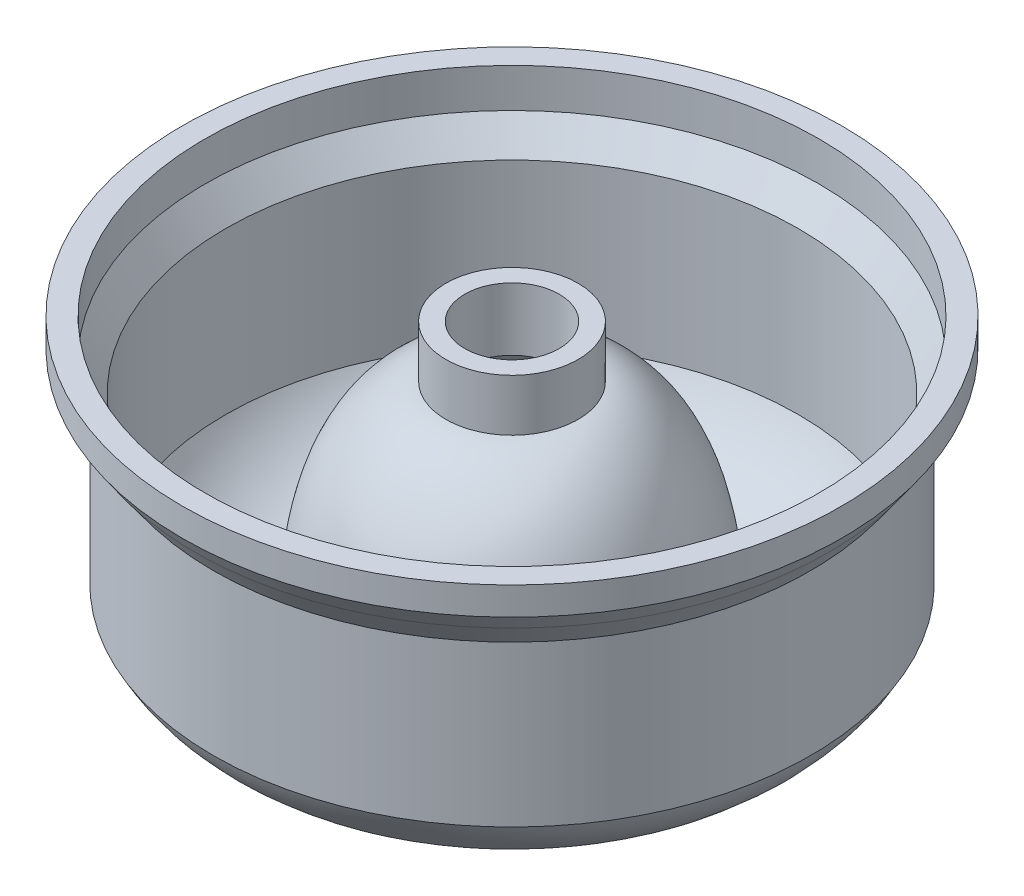
ISO-10303-21;
HEADER;
FILE_DESCRIPTION(('STEP AP214'),'2;1');
FILE_NAME('part.step','',(''),(''),'','','');
FILE_SCHEMA(('AUTOMOTIVE_DESIGN { 1 0 10303 214 1 1 1 1 }'));
ENDSEC;
DATA;
#1=APPLICATION_CONTEXT('core data for automotive mechanical design processes');
#2=APPLICATION_PROTOCOL_DEFINITION('international standard','automotive_design',2000,#1);
#3=PRODUCT_CONTEXT('',#1,'mechanical');
#4=PRODUCT('Part','Part','',(#3));
#5=PRODUCT_RELATED_PRODUCT_CATEGORY('part','',(#4));
#6=PRODUCT_DEFINITION_FORMATION('','',#4);
#7=PRODUCT_DEFINITION_CONTEXT('part definition',#1,'design');
#8=PRODUCT_DEFINITION('design','',#6,#7);
#9=PRODUCT_DEFINITION_SHAPE('','',#8);
#10=(LENGTH_UNIT() NAMED_UNIT(*) SI_UNIT(.MILLI.,.METRE.));
#11=(NAMED_UNIT(*) PLANE_ANGLE_UNIT() SI_UNIT($,.RADIAN.));
#12=(NAMED_UNIT(*) SI_UNIT($,.STERADIAN.) SOLID_ANGLE_UNIT());
#13=UNCERTAINTY_MEASURE_WITH_UNIT(LENGTH_MEASURE(1.E-05),#10,'distance_accuracy_value','');
#14=(GEOMETRIC_REPRESENTATION_CONTEXT(3) GLOBAL_UNCERTAINTY_ASSIGNED_CONTEXT((#13)) GLOBAL_UNIT_ASSIGNED_CONTEXT((#10,
#11,#12)) REPRESENTATION_CONTEXT('',''));
#15=CARTESIAN_POINT('',(0.,0.,0.));
#16=DIRECTION('',(0.,0.,1.));
#17=DIRECTION('',(1.,0.,0.));
#18=AXIS2_PLACEMENT_3D('',#15,#16,#17);
#19=CARTESIAN_POINT('',(-10.5000001564622,30.5810024510066,6.45817993130572E-05));
#20=DIRECTION('',(0.,-1.,0.));
#21=DIRECTION('',(0.,0.,-1.));
#22=AXIS2_PLACEMENT_3D('',#19,#20,#21);
#23=PLANE('',#22);
#24=CARTESIAN_POINT('',(0.,30.5810024510066,6.45817993130572E-05));
#25=DIRECTION('',(0.,-1.,0.));
#26=DIRECTION('',(0.,0.,-1.));
#27=AXIS2_PLACEMENT_3D('',#24,#25,#26);
#28=CIRCLE('',#27,10.5000001564622);
#29=CARTESIAN_POINT('',(0.,30.5810024510066,-10.4999355746629));
#30=VERTEX_POINT('',#29);
#31=EDGE_CURVE('E10',#30,#30,#28,.T.);
#32=ORIENTED_EDGE('',*,*,#31,.F.);
#33=EDGE_LOOP('',(#32));
#34=FACE_BOUND('',#33,.T.);
#35=CARTESIAN_POINT('',(0.,30.5810024510066,6.45817993130572E-05));
#36=DIRECTION('',(0.,-1.,0.));
#37=DIRECTION('',(0.,0.,-1.));
#38=AXIS2_PLACEMENT_3D('',#35,#36,#37);
#39=CIRCLE('',#38,7.50000039115545);
#40=CARTESIAN_POINT('',(0.,30.5810024510066,-7.49993580935613));
#41=VERTEX_POINT('',#40);
#42=EDGE_CURVE('E97',#41,#41,#39,.T.);
#43=ORIENTED_EDGE('',*,*,#42,.T.);
#44=EDGE_LOOP('',(#43));
#45=FACE_BOUND('',#44,.T.);
#46=ADVANCED_FACE('F33',(#34,#45),#23,.F.);
#47=CARTESIAN_POINT('',(0.,-3.16899679462212,6.45817993130572E-05));
#48=DIRECTION('',(0.,-1.,0.));
#49=DIRECTION('',(0.,0.,-1.));
#50=AXIS2_PLACEMENT_3D('',#47,#48,#49);
#51=CYLINDRICAL_SURFACE('',#50,10.5000001564622);
#52=CARTESIAN_POINT('',(0.,22.331003540654,6.45817993130572E-05));
#53=DIRECTION('',(0.,-1.,0.));
#54=DIRECTION('',(0.,0.,-1.));
#55=AXIS2_PLACEMENT_3D('',#52,#53,#54);
#56=CIRCLE('',#55,10.5000001564622);
#57=CARTESIAN_POINT('',(0.,22.331003540654,-10.4999355746629));
#58=VERTEX_POINT('',#57);
#59=EDGE_CURVE('E39',#58,#58,#56,.T.);
#60=ORIENTED_EDGE('',*,*,#59,.F.);
#61=EDGE_LOOP('',(#60));
#62=FACE_BOUND('',#61,.T.);
#63=ORIENTED_EDGE('',*,*,#31,.T.);
#64=EDGE_LOOP('',(#63));
#65=FACE_BOUND('',#64,.T.);
#66=ADVANCED_FACE('F176',(#62,#65),#51,.T.);
#67=CARTESIAN_POINT('',(-10.5000001564622,22.331003540654,6.45817993130572E-05));
#68=CARTESIAN_POINT('',(-12.8042119563069,22.0291969506286,6.45817993130572E-05));
#69=CARTESIAN_POINT('',(-21.4238213403016,16.9942370578348,6.45817993130572E-05));
#70=CARTESIAN_POINT('',(-24.5835315523649,6.47395410737615,6.45817993130572E-05));
#71=CARTESIAN_POINT('',(-25.53859014,-0.47422256425235,6.45817993130572E-05));
#72=B_SPLINE_CURVE_WITH_KNOTS('',3,(#67,#68,#69,#70,#71),.UNSPECIFIED.,.F.,.F.,(4,1,4),(0.,
0.237277576765626,1.),.UNSPECIFIED.);
#73=CARTESIAN_POINT('',(0.,-3.16899679462212,6.45817993130572E-05));
#74=DIRECTION('',(0.,-1.,0.));
#75=AXIS1_PLACEMENT('',#73,#74);
#76=SURFACE_OF_REVOLUTION('',#72,#75);
#77=CARTESIAN_POINT('',(0.,-0.47422256425235,6.45817993130572E-05));
#78=DIRECTION('',(0.,-1.,0.));
#79=DIRECTION('',(0.,0.,-1.));
#80=AXIS2_PLACEMENT_3D('',#77,#78,#79);
#81=CIRCLE('',#80,25.53859014);
#82=CARTESIAN_POINT('',(0.,-0.47422256425235,-25.5385255582007));
#83=VERTEX_POINT('',#82);
#84=EDGE_CURVE('E43',#83,#83,#81,.T.);
#85=ORIENTED_EDGE('',*,*,#84,.F.);
#86=EDGE_LOOP('',(#85));
#87=FACE_BOUND('',#86,.T.);
#88=ORIENTED_EDGE('',*,*,#59,.T.);
#89=EDGE_LOOP('',(#88));
#90=FACE_BOUND('',#89,.T.);
#91=ADVANCED_FACE('F173',(#87,#90),#76,.T.);
#92=CARTESIAN_POINT('',(0.,-3.16899679462212,6.45817993130572E-05));
#93=DIRECTION('',(0.,-1.,0.));
#94=DIRECTION('',(0.,0.,-1.));
#95=AXIS2_PLACEMENT_3D('',#92,#93,#94);
#96=CYLINDRICAL_SURFACE('',#95,25.53859014);
#97=CARTESIAN_POINT('',(0.,-14.5754903953638,6.45817993130572E-05));
#98=DIRECTION('',(0.,-1.,0.));
#99=DIRECTION('',(0.,0.,-1.));
#100=AXIS2_PLACEMENT_3D('',#97,#98,#99);
#101=CIRCLE('',#100,25.53859014);
#102=CARTESIAN_POINT('',(0.,-14.5754903953638,-25.5385255582007));
#103=VERTEX_POINT('',#102);
#104=EDGE_CURVE('E47',#103,#103,#101,.T.);
#105=ORIENTED_EDGE('',*,*,#104,.F.);
#106=EDGE_LOOP('',(#105));
#107=FACE_BOUND('',#106,.T.);
#108=ORIENTED_EDGE('',*,*,#84,.T.);
#109=EDGE_LOOP('',(#108));
#110=FACE_BOUND('',#109,.T.);
#111=ADVANCED_FACE('F169',(#107,#110),#96,.T.);
#112=CARTESIAN_POINT('',(0.,-14.0495839149164,6.45817993130572E-05));
#113=DIRECTION('',(0.,-1.,0.));
#114=DIRECTION('',(0.,0.,-1.));
#115=AXIS2_PLACEMENT_3D('',#112,#113,#114);
#116=TOROIDAL_SURFACE('',#115,26.7235480101972,1.29641921472915);
#117=CARTESIAN_POINT('',(0.,-15.3358713784104,6.45817993130572E-05));
#118=DIRECTION('',(0.,-1.,0.));
#119=DIRECTION('',(0.,0.,-1.));
#120=AXIS2_PLACEMENT_3D('',#117,#118,#119);
#121=CIRCLE('',#120,26.5617847832972);
#122=CARTESIAN_POINT('',(0.,-15.3358713784104,-26.5617202014978));
#123=VERTEX_POINT('',#122);
#124=EDGE_CURVE('E52',#123,#123,#121,.T.);
#125=ORIENTED_EDGE('',*,*,#124,.F.);
#126=EDGE_LOOP('',(#125));
#127=FACE_BOUND('',#126,.T.);
#128=ORIENTED_EDGE('',*,*,#104,.T.);
#129=EDGE_LOOP('',(#128));
#130=FACE_BOUND('',#129,.T.);
#131=ADVANCED_FACE('F165',(#127,#130),#116,.F.);
#132=CARTESIAN_POINT('',(0.,4.38430230998142,6.45817993130572E-05));
#133=DIRECTION('',(0.,-1.,0.));
#134=DIRECTION('',(0.,0.,-1.));
#135=AXIS2_PLACEMENT_3D('',#132,#133,#134);
#136=TOROIDAL_SURFACE('',#135,28.0626253435686,19.777203358607);
#137=CARTESIAN_POINT('',(0.,-4.97394007096082,6.45817993130572E-05));
#138=DIRECTION('',(0.,-1.,0.));
#139=DIRECTION('',(0.,0.,-1.));
#140=AXIS2_PLACEMENT_3D('',#137,#138,#139);
#141=CIRCLE('',#140,45.48562945386);
#142=CARTESIAN_POINT('',(0.,-4.97394007096082,-45.4855648720607));
#143=VERTEX_POINT('',#142);
#144=EDGE_CURVE('E55',#143,#143,#141,.T.);
#145=ORIENTED_EDGE('',*,*,#144,.F.);
#146=EDGE_LOOP('',(#145));
#147=FACE_BOUND('',#146,.T.);
#148=ORIENTED_EDGE('',*,*,#124,.T.);
#149=EDGE_LOOP('',(#148));
#150=FACE_BOUND('',#149,.T.);
#151=ADVANCED_FACE('F161',(#147,#150),#136,.F.);
#152=CARTESIAN_POINT('',(0.,-3.16899679462212,6.45817993130572E-05));
#153=DIRECTION('',(0.,-1.,0.));
#154=DIRECTION('',(0.,0.,-1.));
#155=AXIS2_PLACEMENT_3D('',#152,#153,#154);
#156=CYLINDRICAL_SURFACE('',#155,45.48562945386);
#157=CARTESIAN_POINT('',(0.,20.6186275390306,6.45817993130572E-05));
#158=DIRECTION('',(0.,-1.,0.));
#159=DIRECTION('',(0.,0.,-1.));
#160=AXIS2_PLACEMENT_3D('',#157,#158,#159);
#161=CIRCLE('',#160,45.48562945386);
#162=CARTESIAN_POINT('',(0.,20.6186275390306,-45.4855648720607));
#163=VERTEX_POINT('',#162);
#164=EDGE_CURVE('E58',#163,#163,#161,.T.);
#165=ORIENTED_EDGE('',*,*,#164,.F.);
#166=EDGE_LOOP('',(#165));
#167=FACE_BOUND('',#166,.T.);
#168=ORIENTED_EDGE('',*,*,#144,.T.);
#169=EDGE_LOOP('',(#168));
#170=FACE_BOUND('',#169,.T.);
#171=ADVANCED_FACE('F157',(#167,#170),#156,.F.);
#172=CARTESIAN_POINT('',(0.,20.6186275390306,6.45817993130572E-05));
#173=DIRECTION('',(0.,1.,0.));
#174=DIRECTION('',(0.,0.,1.));
#175=AXIS2_PLACEMENT_3D('',#172,#173,#174);
#176=CONICAL_SURFACE('',#175,45.48562945386,0.628409979727612);
#177=CARTESIAN_POINT('',(0.,25.1223851766911,6.45817993130572E-05));
#178=DIRECTION('',(0.,-1.,0.));
#179=DIRECTION('',(0.,0.,-1.));
#180=AXIS2_PLACEMENT_3D('',#177,#178,#179);
#181=CIRCLE('',#180,48.7584302277292);
#182=CARTESIAN_POINT('',(0.,25.1223851766911,-48.7583656459299));
#183=VERTEX_POINT('',#182);
#184=EDGE_CURVE('E61',#183,#183,#181,.T.);
#185=ORIENTED_EDGE('',*,*,#184,.F.);
#186=EDGE_LOOP('',(#185));
#187=FACE_BOUND('',#186,.T.);
#188=ORIENTED_EDGE('',*,*,#164,.T.);
#189=EDGE_LOOP('',(#188));
#190=FACE_BOUND('',#189,.T.);
#191=ADVANCED_FACE('F153',(#187,#190),#176,.F.);
#192=CARTESIAN_POINT('',(0.,-3.16899679462212,6.45817993130572E-05));
#193=DIRECTION('',(0.,-1.,0.));
#194=DIRECTION('',(0.,0.,-1.));
#195=AXIS2_PLACEMENT_3D('',#192,#193,#194);
#196=CYLINDRICAL_SURFACE('',#195,48.758430227729);
#197=CARTESIAN_POINT('',(0.,31.3310024342427,6.45817993130572E-05));
#198=DIRECTION('',(0.,-1.,0.));
#199=DIRECTION('',(0.,0.,-1.));
#200=AXIS2_PLACEMENT_3D('',#197,#198,#199);
#201=CIRCLE('',#200,48.758430227729);
#202=CARTESIAN_POINT('',(0.,31.3310024342427,-48.7583656459297));
#203=VERTEX_POINT('',#202);
#204=EDGE_CURVE('E64',#203,#203,#201,.T.);
#205=ORIENTED_EDGE('',*,*,#204,.F.);
#206=EDGE_LOOP('',(#205));
#207=FACE_BOUND('',#206,.T.);
#208=ORIENTED_EDGE('',*,*,#184,.T.);
#209=EDGE_LOOP('',(#208));
#210=FACE_BOUND('',#209,.T.);
#211=ADVANCED_FACE('F149',(#207,#210),#196,.F.);
#212=CARTESIAN_POINT('',(-52.358430227729,31.3310024342427,6.45817993130572E-05));
#213=DIRECTION('',(0.,-1.,0.));
#214=DIRECTION('',(0.,0.,-1.));
#215=AXIS2_PLACEMENT_3D('',#212,#213,#214);
#216=PLANE('',#215);
#217=CARTESIAN_POINT('',(0.,31.3310024342427,6.45817993130572E-05));
#218=DIRECTION('',(0.,-1.,0.));
#219=DIRECTION('',(0.,0.,-1.));
#220=AXIS2_PLACEMENT_3D('',#217,#218,#219);
#221=CIRCLE('',#220,52.358430227729);
#222=CARTESIAN_POINT('',(0.,31.3310024342427,-52.3583656459297));
#223=VERTEX_POINT('',#222);
#224=EDGE_CURVE('E67',#223,#223,#221,.T.);
#225=ORIENTED_EDGE('',*,*,#224,.F.);
#226=EDGE_LOOP('',(#225));
#227=FACE_BOUND('',#226,.T.);
#228=ORIENTED_EDGE('',*,*,#204,.T.);
#229=EDGE_LOOP('',(#228));
#230=FACE_BOUND('',#229,.T.);
#231=ADVANCED_FACE('F145',(#227,#230),#216,.F.);
#232=CARTESIAN_POINT('',(0.,-3.16899679462212,6.45817993130572E-05));
#233=DIRECTION('',(0.,-1.,0.));
#234=DIRECTION('',(0.,0.,-1.));
#235=AXIS2_PLACEMENT_3D('',#232,#233,#234);
#236=CYLINDRICAL_SURFACE('',#235,52.358430227729);
#237=CARTESIAN_POINT('',(0.,26.901965740835,6.45817993130572E-05));
#238=DIRECTION('',(0.,-1.,0.));
#239=DIRECTION('',(0.,0.,-1.));
#240=AXIS2_PLACEMENT_3D('',#237,#238,#239);
#241=CIRCLE('',#240,52.358430227729);
#242=CARTESIAN_POINT('',(0.,26.901965740835,-52.3583656459297));
#243=VERTEX_POINT('',#242);
#244=EDGE_CURVE('E70',#243,#243,#241,.T.);
#245=ORIENTED_EDGE('',*,*,#244,.F.);
#246=EDGE_LOOP('',(#245));
#247=FACE_BOUND('',#246,.T.);
#248=ORIENTED_EDGE('',*,*,#224,.T.);
#249=EDGE_LOOP('',(#248));
#250=FACE_BOUND('',#249,.T.);
#251=ADVANCED_FACE('F141',(#247,#250),#236,.T.);
#252=CARTESIAN_POINT('',(0.,26.901965740835,6.45817993130572E-05));
#253=DIRECTION('',(0.,1.,0.));
#254=DIRECTION('',(0.,0.,1.));
#255=AXIS2_PLACEMENT_3D('',#252,#253,#254);
#256=CONICAL_SURFACE('',#255,52.358430227729,0.604826792035094);
#257=CARTESIAN_POINT('',(0.,23.976059671098,6.45817993130572E-05));
#258=DIRECTION('',(0.,-1.,0.));
#259=DIRECTION('',(0.,0.,-1.));
#260=AXIS2_PLACEMENT_3D('',#257,#258,#259);
#261=CIRCLE('',#260,50.3359085430244);
#262=CARTESIAN_POINT('',(0.,23.976059671098,-50.3358439612251));
#263=VERTEX_POINT('',#262);
#264=EDGE_CURVE('E73',#263,#263,#261,.T.);
#265=ORIENTED_EDGE('',*,*,#264,.F.);
#266=EDGE_LOOP('',(#265));
#267=FACE_BOUND('',#266,.T.);
#268=ORIENTED_EDGE('',*,*,#244,.T.);
#269=EDGE_LOOP('',(#268));
#270=FACE_BOUND('',#269,.T.);
#271=ADVANCED_FACE('F137',(#267,#270),#256,.T.);
#272=CARTESIAN_POINT('',(0.,23.976059671098,6.45817993130572E-05));
#273=DIRECTION('',(0.,1.,0.));
#274=DIRECTION('',(0.,0.,1.));
#275=AXIS2_PLACEMENT_3D('',#272,#273,#274);
#276=CONICAL_SURFACE('',#275,50.3359085430244,0.628409979727613);
#277=CARTESIAN_POINT('',(0.,19.9849355539618,6.45817993130572E-05));
#278=DIRECTION('',(0.,-1.,0.));
#279=DIRECTION('',(0.,0.,-1.));
#280=AXIS2_PLACEMENT_3D('',#277,#278,#279);
#281=CIRCLE('',#280,47.43562945386);
#282=CARTESIAN_POINT('',(0.,19.9849355539618,-47.4355648720607));
#283=VERTEX_POINT('',#282);
#284=EDGE_CURVE('E76',#283,#283,#281,.T.);
#285=ORIENTED_EDGE('',*,*,#284,.F.);
#286=EDGE_LOOP('',(#285));
#287=FACE_BOUND('',#286,.T.);
#288=ORIENTED_EDGE('',*,*,#264,.T.);
#289=EDGE_LOOP('',(#288));
#290=FACE_BOUND('',#289,.T.);
#291=ADVANCED_FACE('F133',(#287,#290),#276,.T.);
#292=CARTESIAN_POINT('',(0.,-3.16899679462212,6.45817993130572E-05));
#293=DIRECTION('',(0.,-1.,0.));
#294=DIRECTION('',(0.,0.,-1.));
#295=AXIS2_PLACEMENT_3D('',#292,#293,#294);
#296=CYLINDRICAL_SURFACE('',#295,47.43562945386);
#297=CARTESIAN_POINT('',(0.,-5.45226607177114,6.45817993130572E-05));
#298=DIRECTION('',(0.,-1.,0.));
#299=DIRECTION('',(0.,0.,-1.));
#300=AXIS2_PLACEMENT_3D('',#297,#298,#299);
#301=CIRCLE('',#300,47.43562945386);
#302=CARTESIAN_POINT('',(0.,-5.45226607177114,-47.4355648720607));
#303=VERTEX_POINT('',#302);
#304=EDGE_CURVE('E79',#303,#303,#301,.T.);
#305=ORIENTED_EDGE('',*,*,#304,.F.);
#306=EDGE_LOOP('',(#305));
#307=FACE_BOUND('',#306,.T.);
#308=ORIENTED_EDGE('',*,*,#284,.T.);
#309=EDGE_LOOP('',(#308));
#310=FACE_BOUND('',#309,.T.);
#311=ADVANCED_FACE('F129',(#307,#310),#296,.T.);
#312=CARTESIAN_POINT('',(0.,4.38430230998142,6.45817993130572E-05));
#313=DIRECTION('',(0.,-1.,0.));
#314=DIRECTION('',(0.,0.,-1.));
#315=AXIS2_PLACEMENT_3D('',#312,#313,#314);
#316=TOROIDAL_SURFACE('',#315,28.0626253435686,21.727203358607);
#317=CARTESIAN_POINT('',(0.,-17.2773171059267,6.45817993130572E-05));
#318=DIRECTION('',(0.,-1.,0.));
#319=DIRECTION('',(0.,0.,-1.));
#320=AXIS2_PLACEMENT_3D('',#317,#318,#319);
#321=CIRCLE('',#320,26.375731729076);
#322=CARTESIAN_POINT('',(0.,-17.2773171059267,-26.3756671472766));
#323=VERTEX_POINT('',#322);
#324=EDGE_CURVE('E82',#323,#323,#321,.T.);
#325=ORIENTED_EDGE('',*,*,#324,.F.);
#326=EDGE_LOOP('',(#325));
#327=FACE_BOUND('',#326,.T.);
#328=ORIENTED_EDGE('',*,*,#304,.T.);
#329=EDGE_LOOP('',(#328));
#330=FACE_BOUND('',#329,.T.);
#331=ADVANCED_FACE('F125',(#327,#330),#316,.T.);
#332=CARTESIAN_POINT('',(0.,-14.0495839149164,6.45817993130572E-05));
#333=DIRECTION('',(0.,-1.,0.));
#334=DIRECTION('',(0.,0.,-1.));
#335=AXIS2_PLACEMENT_3D('',#332,#333,#334);
#336=TOROIDAL_SURFACE('',#335,26.7235480101972,3.24641921472915);
#337=CARTESIAN_POINT('',(0.,-14.8929562347438,6.45817993130572E-05));
#338=DIRECTION('',(0.,-1.,0.));
#339=DIRECTION('',(0.,0.,-1.));
#340=AXIS2_PLACEMENT_3D('',#337,#338,#339);
#341=CIRCLE('',#340,23.58859014);
#342=CARTESIAN_POINT('',(0.,-14.8929562347438,-23.5885255582007));
#343=VERTEX_POINT('',#342);
#344=EDGE_CURVE('E85',#343,#343,#341,.T.);
#345=ORIENTED_EDGE('',*,*,#344,.F.);
#346=EDGE_LOOP('',(#345));
#347=FACE_BOUND('',#346,.T.);
#348=ORIENTED_EDGE('',*,*,#324,.T.);
#349=EDGE_LOOP('',(#348));
#350=FACE_BOUND('',#349,.T.);
#351=ADVANCED_FACE('F121',(#347,#350),#336,.T.);
#352=CARTESIAN_POINT('',(0.,-3.16899679462212,6.45817993130572E-05));
#353=DIRECTION('',(0.,-1.,0.));
#354=DIRECTION('',(0.,0.,-1.));
#355=AXIS2_PLACEMENT_3D('',#352,#353,#354);
#356=CYLINDRICAL_SURFACE('',#355,23.58859014);
#357=CARTESIAN_POINT('',(0.,-0.608782107745847,6.45817993130572E-05));
#358=DIRECTION('',(0.,-1.,0.));
#359=DIRECTION('',(0.,0.,-1.));
#360=AXIS2_PLACEMENT_3D('',#357,#358,#359);
#361=CIRCLE('',#360,23.58859014);
#362=CARTESIAN_POINT('',(0.,-0.608782107745847,-23.5885255582007));
#363=VERTEX_POINT('',#362);
#364=EDGE_CURVE('E88',#363,#363,#361,.T.);
#365=ORIENTED_EDGE('',*,*,#364,.F.);
#366=EDGE_LOOP('',(#365));
#367=FACE_BOUND('',#366,.T.);
#368=ORIENTED_EDGE('',*,*,#344,.T.);
#369=EDGE_LOOP('',(#368));
#370=FACE_BOUND('',#369,.T.);
#371=ADVANCED_FACE('F116',(#367,#370),#356,.F.);
#372=CARTESIAN_POINT('',(-23.58859014,-0.608782107745847,6.45817993130572E-05));
#373=CARTESIAN_POINT('',(-23.4225351219764,0.578093965781366,6.45817993130572E-05));
#374=CARTESIAN_POINT('',(-23.0194961238421,2.91566357303179,6.45817993130572E-05));
#375=CARTESIAN_POINT('',(-22.1069196042582,6.52356936000979,6.45817993130572E-05));
#376=CARTESIAN_POINT('',(-20.8581498787164,10.0006470093386,6.45817993130572E-05));
#377=CARTESIAN_POINT('',(-19.2316781262938,13.2389516735848,6.45817993130572E-05));
#378=CARTESIAN_POINT('',(-17.2096308671527,16.0935250904595,6.45817993130572E-05));
#379=CARTESIAN_POINT('',(-15.1418075177234,18.0992412291758,6.45817993130572E-05));
#380=CARTESIAN_POINT('',(-13.311129648796,19.3501151693256,6.45817993130572E-05));
#381=CARTESIAN_POINT('',(-12.1223838989228,19.9196860693526,6.45817993130572E-05));
#382=CARTESIAN_POINT('',(-11.1612774035245,20.2288908852393,6.45817993130572E-05));
#383=CARTESIAN_POINT('',(-10.5941454174923,20.3490939120433,6.45817993130572E-05));
#384=CARTESIAN_POINT('',(-10.2412328855681,20.3985792982432,6.45817993130572E-05));
#385=CARTESIAN_POINT('',(-9.90097049913507,20.4426156195241,6.45817993130572E-05));
#386=CARTESIAN_POINT('',(-9.35472415029149,20.5145013393527,6.45817993130572E-05));
#387=CARTESIAN_POINT('',(-8.86964002474071,20.5778929308903,6.45817993130572E-05));
#388=CARTESIAN_POINT('',(-8.55000015646222,20.6197594896362,6.45817993130572E-05));
#389=B_SPLINE_CURVE_WITH_KNOTS('',3,(#372,#373,#374,#375,#376,#377,#378,#379,#380,#381,#382,
#383,#384,#385,#386,#387,#388),.UNSPECIFIED.,.F.,.F.,(4,1,1,1,1,1,1,1,1,1,1,1,1,1,4),
(-0.0582413247361293,0.0734190953483689,0.205079515432867,0.336739935517365,0.468400355601863,
0.600060775686361,0.731721195770859,0.797551405813109,0.863381615855358,0.896296720876482,
0.929211825897607,0.937440602152888,0.945669378408169,0.962126930918731,0.995042035939856),.UNSPECIFIED.);
#390=CARTESIAN_POINT('',(0.,-3.16899679462212,6.45817993130572E-05));
#391=DIRECTION('',(0.,-1.,0.));
#392=AXIS1_PLACEMENT('',#390,#391);
#393=SURFACE_OF_REVOLUTION('',#389,#392);
#394=CARTESIAN_POINT('',(0.,20.6197594896362,6.45817993130572E-05));
#395=DIRECTION('',(0.,-1.,0.));
#396=DIRECTION('',(0.,0.,-1.));
#397=AXIS2_PLACEMENT_3D('',#394,#395,#396);
#398=CIRCLE('',#397,8.55000015646222);
#399=CARTESIAN_POINT('',(0.,20.6197594896362,-8.54993557466291));
#400=VERTEX_POINT('',#399);
#401=EDGE_CURVE('E91',#400,#400,#398,.T.);
#402=ORIENTED_EDGE('',*,*,#401,.F.);
#403=EDGE_LOOP('',(#402));
#404=FACE_BOUND('',#403,.T.);
#405=ORIENTED_EDGE('',*,*,#364,.T.);
#406=EDGE_LOOP('',(#405));
#407=FACE_BOUND('',#406,.T.);
#408=ADVANCED_FACE('F111',(#404,#407),#393,.T.);
#409=CARTESIAN_POINT('',(-8.55000015646222,20.6197594896362,6.45817993130572E-05));
#410=DIRECTION('',(0.,1.,0.));
#411=DIRECTION('',(0.,0.,1.));
#412=AXIS2_PLACEMENT_3D('',#409,#410,#411);
#413=PLANE('',#412);
#414=CARTESIAN_POINT('',(0.,20.6197594896362,6.45817993130572E-05));
#415=DIRECTION('',(0.,-1.,0.));
#416=DIRECTION('',(0.,0.,-1.));
#417=AXIS2_PLACEMENT_3D('',#414,#415,#416);
#418=CIRCLE('',#417,7.50000039115545);
#419=CARTESIAN_POINT('',(0.,20.6197594896362,-7.49993580935613));
#420=VERTEX_POINT('',#419);
#421=EDGE_CURVE('E94',#420,#420,#418,.T.);
#422=ORIENTED_EDGE('',*,*,#421,.F.);
#423=EDGE_LOOP('',(#422));
#424=FACE_BOUND('',#423,.T.);
#425=ORIENTED_EDGE('',*,*,#401,.T.);
#426=EDGE_LOOP('',(#425));
#427=FACE_BOUND('',#426,.T.);
#428=ADVANCED_FACE('F115',(#424,#427),#413,.F.);
#429=CARTESIAN_POINT('',(0.,-3.16899679462212,6.45817993130572E-05));
#430=DIRECTION('',(0.,-1.,0.));
#431=DIRECTION('',(0.,0.,-1.));
#432=AXIS2_PLACEMENT_3D('',#429,#430,#431);
#433=CYLINDRICAL_SURFACE('',#432,7.50000039115545);
#434=ORIENTED_EDGE('',*,*,#42,.F.);
#435=EDGE_LOOP('',(#434));
#436=FACE_BOUND('',#435,.T.);
#437=ORIENTED_EDGE('',*,*,#421,.T.);
#438=EDGE_LOOP('',(#437));
#439=FACE_BOUND('',#438,.T.);
#440=ADVANCED_FACE('F189',(#436,#439),#433,.F.);
#441=CLOSED_SHELL('',(#46,#66,#91,#111,#131,#151,#171,#191,#211,#231,#251,#271,#291,#311,#331,
#351,#371,#408,#428,#440));
#442=MANIFOLD_SOLID_BREP('B2',#441);
#443=ADVANCED_BREP_SHAPE_REPRESENTATION('',(#18,#442),#14);
#444=SHAPE_DEFINITION_REPRESENTATION(#9,#443);
ENDSEC;
END-ISO-10303-21;
